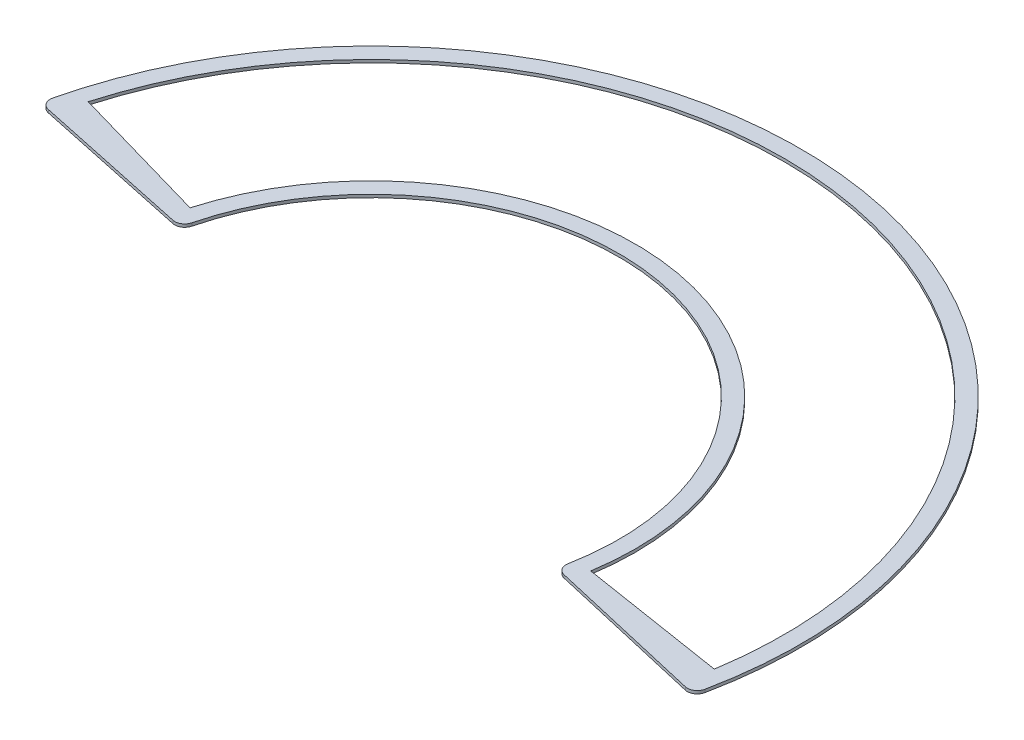
ISO-10303-21;
HEADER;
FILE_DESCRIPTION(('STEP AP214'),'2;1');
FILE_NAME('part.step','',(''),(''),'','','');
FILE_SCHEMA(('AUTOMOTIVE_DESIGN { 1 0 10303 214 1 1 1 1 }'));
ENDSEC;
DATA;
#1=APPLICATION_CONTEXT('core data for automotive mechanical design processes');
#2=APPLICATION_PROTOCOL_DEFINITION('international standard','automotive_design',2000,#1);
#3=PRODUCT_CONTEXT('',#1,'mechanical');
#4=PRODUCT('Part','Part','',(#3));
#5=PRODUCT_RELATED_PRODUCT_CATEGORY('part','',(#4));
#6=PRODUCT_DEFINITION_FORMATION('','',#4);
#7=PRODUCT_DEFINITION_CONTEXT('part definition',#1,'design');
#8=PRODUCT_DEFINITION('design','',#6,#7);
#9=PRODUCT_DEFINITION_SHAPE('','',#8);
#10=(LENGTH_UNIT() NAMED_UNIT(*) SI_UNIT(.MILLI.,.METRE.));
#11=(NAMED_UNIT(*) PLANE_ANGLE_UNIT() SI_UNIT($,.RADIAN.));
#12=(NAMED_UNIT(*) SI_UNIT($,.STERADIAN.) SOLID_ANGLE_UNIT());
#13=UNCERTAINTY_MEASURE_WITH_UNIT(LENGTH_MEASURE(1.E-05),#10,'distance_accuracy_value','');
#14=(GEOMETRIC_REPRESENTATION_CONTEXT(3) GLOBAL_UNCERTAINTY_ASSIGNED_CONTEXT((#13)) GLOBAL_UNIT_ASSIGNED_CONTEXT((#10,
#11,#12)) REPRESENTATION_CONTEXT('',''));
#15=CARTESIAN_POINT('',(0.,0.,0.));
#16=DIRECTION('',(0.,0.,1.));
#17=DIRECTION('',(1.,0.,0.));
#18=AXIS2_PLACEMENT_3D('',#15,#16,#17);
#19=CARTESIAN_POINT('',(124.38532164962,-0.9,25.6377018884395));
#20=DIRECTION('',(0.,1.,0.));
#21=DIRECTION('',(0.,0.,1.));
#22=AXIS2_PLACEMENT_3D('',#19,#20,#21);
#23=CYLINDRICAL_SURFACE('',#22,3.);
#24=CARTESIAN_POINT('',(124.38532164962,0.,25.6377018884395));
#25=DIRECTION('',(0.,1.,0.));
#26=DIRECTION('',(0.,0.,1.));
#27=AXIS2_PLACEMENT_3D('',#24,#25,#26);
#28=CIRCLE('',#27,3.);
#29=CARTESIAN_POINT('',(123.710468486589,0.,28.5608120827952));
#30=VERTEX_POINT('',#29);
#31=CARTESIAN_POINT('',(127.3235575941,0.,26.2433168936783));
#32=VERTEX_POINT('',#31);
#33=EDGE_CURVE('E160',#30,#32,#28,.T.);
#34=ORIENTED_EDGE('',*,*,#33,.F.);
#35=DIRECTION('',(0.,1.,0.));
#36=VECTOR('',#35,1.);
#37=CARTESIAN_POINT('',(123.710468486589,-0.9,28.5608120827952));
#38=LINE('',#37,#36);
#39=CARTESIAN_POINT('',(123.710468486589,-0.9,28.5608120827952));
#40=VERTEX_POINT('',#39);
#41=EDGE_CURVE('E11',#40,#30,#38,.T.);
#42=ORIENTED_EDGE('',*,*,#41,.F.);
#43=CARTESIAN_POINT('',(124.38532164962,-0.9,25.6377018884395));
#44=DIRECTION('',(0.,1.,0.));
#45=DIRECTION('',(0.,0.,1.));
#46=AXIS2_PLACEMENT_3D('',#43,#44,#45);
#47=CIRCLE('',#46,3.);
#48=CARTESIAN_POINT('',(127.3235575941,-0.9,26.2433168936783));
#49=VERTEX_POINT('',#48);
#50=EDGE_CURVE('E164',#40,#49,#47,.T.);
#51=ORIENTED_EDGE('',*,*,#50,.T.);
#52=DIRECTION('',(0.,1.,0.));
#53=VECTOR('',#52,1.);
#54=CARTESIAN_POINT('',(127.3235575941,-0.9,26.2433168936783));
#55=LINE('',#54,#53);
#56=EDGE_CURVE('E41',#49,#32,#55,.T.);
#57=ORIENTED_EDGE('',*,*,#56,.T.);
#58=EDGE_LOOP('',(#34,#42,#51,#57));
#59=FACE_BOUND('',#58,.T.);
#60=ADVANCED_FACE('F38',(#59),#23,.T.);
#61=CARTESIAN_POINT('',(75.9446305911992,-0.9,17.5331994902896));
#62=DIRECTION('',(-0.224951054343869,0.,0.974370064785234));
#63=DIRECTION('',(0.974370064785234,0.,0.224951054343869));
#64=AXIS2_PLACEMENT_3D('',#61,#62,#63);
#65=PLANE('',#64);
#66=DIRECTION('',(0.974370064785234,0.,0.224951054343869));
#67=VECTOR('',#66,1.);
#68=CARTESIAN_POINT('',(75.9446305911992,0.,17.5331994902896));
#69=LINE('',#68,#67);
#70=CARTESIAN_POINT('',(75.9446305911992,0.,17.5331994902896));
#71=VERTEX_POINT('',#70);
#72=EDGE_CURVE('E168',#71,#30,#69,.T.);
#73=ORIENTED_EDGE('',*,*,#72,.F.);
#74=DIRECTION('',(0.,1.,0.));
#75=VECTOR('',#74,1.);
#76=CARTESIAN_POINT('',(75.9446305911992,-0.9,17.5331994902896));
#77=LINE('',#76,#75);
#78=CARTESIAN_POINT('',(75.9446305911992,-0.9,17.5331994902896));
#79=VERTEX_POINT('',#78);
#80=EDGE_CURVE('E46',#79,#71,#77,.T.);
#81=ORIENTED_EDGE('',*,*,#80,.F.);
#82=DIRECTION('',(0.974370064785234,0.,0.224951054343869));
#83=VECTOR('',#82,1.);
#84=CARTESIAN_POINT('',(75.9446305911992,-0.9,17.5331994902896));
#85=LINE('',#84,#83);
#86=EDGE_CURVE('E186',#79,#40,#85,.T.);
#87=ORIENTED_EDGE('',*,*,#86,.T.);
#88=ORIENTED_EDGE('',*,*,#41,.T.);
#89=EDGE_LOOP('',(#73,#81,#87,#88));
#90=FACE_BOUND('',#89,.T.);
#91=ADVANCED_FACE('F233',(#90),#65,.T.);
#92=CARTESIAN_POINT('',(76.6194837542308,-0.9,14.6100892959339));
#93=DIRECTION('',(0.,1.,0.));
#94=DIRECTION('',(0.,0.,1.));
#95=AXIS2_PLACEMENT_3D('',#92,#93,#94);
#96=CYLINDRICAL_SURFACE('',#95,3.00000000000001);
#97=CARTESIAN_POINT('',(76.6194837542308,0.,14.6100892959339));
#98=DIRECTION('',(0.,1.,0.));
#99=DIRECTION('',(0.,0.,1.));
#100=AXIS2_PLACEMENT_3D('',#97,#98,#99);
#101=CIRCLE('',#100,3.00000000000001);
#102=CARTESIAN_POINT('',(73.6725805329142,0.,14.0481627845518));
#103=VERTEX_POINT('',#102);
#104=EDGE_CURVE('E206',#103,#71,#101,.T.);
#105=ORIENTED_EDGE('',*,*,#104,.F.);
#106=DIRECTION('',(0.,1.,0.));
#107=VECTOR('',#106,1.);
#108=CARTESIAN_POINT('',(73.6725805329142,-0.9,14.0481627845518));
#109=LINE('',#108,#107);
#110=CARTESIAN_POINT('',(73.6725805329142,-0.9,14.0481627845518));
#111=VERTEX_POINT('',#110);
#112=EDGE_CURVE('E212',#111,#103,#109,.T.);
#113=ORIENTED_EDGE('',*,*,#112,.F.);
#114=CARTESIAN_POINT('',(76.6194837542308,-0.9,14.6100892959339));
#115=DIRECTION('',(0.,1.,0.));
#116=DIRECTION('',(0.,0.,1.));
#117=AXIS2_PLACEMENT_3D('',#114,#115,#116);
#118=CIRCLE('',#117,3.00000000000001);
#119=EDGE_CURVE('E183',#111,#79,#118,.T.);
#120=ORIENTED_EDGE('',*,*,#119,.T.);
#121=ORIENTED_EDGE('',*,*,#80,.T.);
#122=EDGE_LOOP('',(#105,#113,#120,#121));
#123=FACE_BOUND('',#122,.T.);
#124=ADVANCED_FACE('F252',(#123),#96,.T.);
#125=CARTESIAN_POINT('',(0.,-0.9,0.));
#126=DIRECTION('',(0.,1.,0.));
#127=DIRECTION('',(0.,0.,1.));
#128=AXIS2_PLACEMENT_3D('',#125,#126,#127);
#129=CYLINDRICAL_SURFACE('',#128,75.);
#130=CARTESIAN_POINT('',(0.,0.,0.));
#131=DIRECTION('',(0.,-1.,0.));
#132=DIRECTION('',(0.,0.,1.));
#133=AXIS2_PLACEMENT_3D('',#130,#131,#132);
#134=CIRCLE('',#133,75.);
#135=CARTESIAN_POINT('',(-72.7070435647225,0.,-18.4034185975742));
#136=VERTEX_POINT('',#135);
#137=EDGE_CURVE('E203',#136,#103,#134,.T.);
#138=ORIENTED_EDGE('',*,*,#137,.F.);
#139=DIRECTION('',(0.,1.,0.));
#140=VECTOR('',#139,1.);
#141=CARTESIAN_POINT('',(-72.7070435647225,-0.9,-18.4034185975742));
#142=LINE('',#141,#140);
#143=CARTESIAN_POINT('',(-72.7070435647225,-0.9,-18.4034185975742));
#144=VERTEX_POINT('',#143);
#145=EDGE_CURVE('E214',#144,#136,#142,.T.);
#146=ORIENTED_EDGE('',*,*,#145,.F.);
#147=CARTESIAN_POINT('',(0.,-0.9,0.));
#148=DIRECTION('',(0.,-1.,0.));
#149=DIRECTION('',(0.,0.,1.));
#150=AXIS2_PLACEMENT_3D('',#147,#148,#149);
#151=CIRCLE('',#150,75.);
#152=EDGE_CURVE('E180',#144,#111,#151,.T.);
#153=ORIENTED_EDGE('',*,*,#152,.T.);
#154=ORIENTED_EDGE('',*,*,#112,.T.);
#155=EDGE_LOOP('',(#138,#146,#153,#154));
#156=FACE_BOUND('',#155,.T.);
#157=ADVANCED_FACE('F250',(#156),#129,.F.);
#158=CARTESIAN_POINT('',(-75.6153253073114,-0.9,-19.1395553414771));
#159=DIRECTION('',(0.,1.,0.));
#160=DIRECTION('',(0.,0.,1.));
#161=AXIS2_PLACEMENT_3D('',#158,#159,#160);
#162=CYLINDRICAL_SURFACE('',#161,2.99999999999999);
#163=CARTESIAN_POINT('',(-75.6153253073114,0.,-19.1395553414771));
#164=DIRECTION('',(0.,1.,0.));
#165=DIRECTION('',(0.,0.,-1.));
#166=AXIS2_PLACEMENT_3D('',#163,#164,#165);
#167=CIRCLE('',#166,2.99999999999999);
#168=CARTESIAN_POINT('',(-76.2390603797647,0.,-16.2051125392757));
#169=VERTEX_POINT('',#168);
#170=EDGE_CURVE('E200',#169,#136,#167,.T.);
#171=ORIENTED_EDGE('',*,*,#170,.F.);
#172=DIRECTION('',(0.,1.,0.));
#173=VECTOR('',#172,1.);
#174=CARTESIAN_POINT('',(-76.2390603797647,-0.9,-16.2051125392757));
#175=LINE('',#174,#173);
#176=CARTESIAN_POINT('',(-76.2390603797647,-0.9,-16.2051125392757));
#177=VERTEX_POINT('',#176);
#178=EDGE_CURVE('E216',#177,#169,#175,.T.);
#179=ORIENTED_EDGE('',*,*,#178,.F.);
#180=CARTESIAN_POINT('',(-75.6153253073114,-0.9,-19.1395553414771));
#181=DIRECTION('',(0.,1.,0.));
#182=DIRECTION('',(0.,0.,-1.));
#183=AXIS2_PLACEMENT_3D('',#180,#181,#182);
#184=CIRCLE('',#183,2.99999999999999);
#185=EDGE_CURVE('E177',#177,#144,#184,.T.);
#186=ORIENTED_EDGE('',*,*,#185,.T.);
#187=ORIENTED_EDGE('',*,*,#145,.T.);
#188=EDGE_LOOP('',(#171,#179,#186,#187));
#189=FACE_BOUND('',#188,.T.);
#190=ADVANCED_FACE('F246',(#189),#162,.T.);
#191=CARTESIAN_POINT('',(-76.2390603797647,-0.9,-16.2051125392757));
#192=DIRECTION('',(-0.207911690817756,0.,0.978147600733806));
#193=DIRECTION('',(0.978147600733806,0.,0.207911690817756));
#194=AXIS2_PLACEMENT_3D('',#191,#192,#193);
#195=PLANE('',#194);
#196=DIRECTION('',(0.978147600733806,0.,0.207911690817756));
#197=VECTOR('',#196,1.);
#198=CARTESIAN_POINT('',(-76.2390603797647,0.,-16.2051125392757));
#199=LINE('',#198,#197);
#200=CARTESIAN_POINT('',(-124.190081683681,0.,-26.397416756202));
#201=VERTEX_POINT('',#200);
#202=EDGE_CURVE('E197',#201,#169,#199,.T.);
#203=ORIENTED_EDGE('',*,*,#202,.F.);
#204=DIRECTION('',(0.,1.,0.));
#205=VECTOR('',#204,1.);
#206=CARTESIAN_POINT('',(-124.190081683681,-0.9,-26.397416756202));
#207=LINE('',#206,#205);
#208=CARTESIAN_POINT('',(-124.190081683681,-0.9,-26.397416756202));
#209=VERTEX_POINT('',#208);
#210=EDGE_CURVE('E218',#209,#201,#207,.T.);
#211=ORIENTED_EDGE('',*,*,#210,.F.);
#212=DIRECTION('',(0.978147600733806,0.,0.207911690817756));
#213=VECTOR('',#212,1.);
#214=CARTESIAN_POINT('',(-76.2390603797647,-0.9,-16.2051125392757));
#215=LINE('',#214,#213);
#216=EDGE_CURVE('E174',#209,#177,#215,.T.);
#217=ORIENTED_EDGE('',*,*,#216,.T.);
#218=ORIENTED_EDGE('',*,*,#178,.T.);
#219=EDGE_LOOP('',(#203,#211,#217,#218));
#220=FACE_BOUND('',#219,.T.);
#221=ADVANCED_FACE('F244',(#220),#195,.T.);
#222=CARTESIAN_POINT('',(-123.566346611228,-0.9,-29.3318595584034));
#223=DIRECTION('',(0.,1.,0.));
#224=DIRECTION('',(0.,0.,1.));
#225=AXIS2_PLACEMENT_3D('',#222,#223,#224);
#226=CYLINDRICAL_SURFACE('',#225,3.);
#227=CARTESIAN_POINT('',(-123.566346611228,0.,-29.3318595584034));
#228=DIRECTION('',(0.,1.,0.));
#229=DIRECTION('',(0.,0.,-1.));
#230=AXIS2_PLACEMENT_3D('',#227,#228,#229);
#231=CIRCLE('',#230,3.);
#232=CARTESIAN_POINT('',(-126.485236688658,0.,-30.0247381306492));
#233=VERTEX_POINT('',#232);
#234=EDGE_CURVE('E194',#233,#201,#231,.T.);
#235=ORIENTED_EDGE('',*,*,#234,.F.);
#236=DIRECTION('',(0.,1.,0.));
#237=VECTOR('',#236,1.);
#238=CARTESIAN_POINT('',(-126.485236688658,-0.9,-30.0247381306492));
#239=LINE('',#238,#237);
#240=CARTESIAN_POINT('',(-126.485236688658,-0.9,-30.0247381306492));
#241=VERTEX_POINT('',#240);
#242=EDGE_CURVE('E219',#241,#233,#239,.T.);
#243=ORIENTED_EDGE('',*,*,#242,.F.);
#244=CARTESIAN_POINT('',(-123.566346611228,-0.9,-29.3318595584034));
#245=DIRECTION('',(0.,1.,0.));
#246=DIRECTION('',(0.,0.,-1.));
#247=AXIS2_PLACEMENT_3D('',#244,#245,#246);
#248=CIRCLE('',#247,3.);
#249=EDGE_CURVE('E171',#241,#209,#248,.T.);
#250=ORIENTED_EDGE('',*,*,#249,.T.);
#251=ORIENTED_EDGE('',*,*,#210,.T.);
#252=EDGE_LOOP('',(#235,#243,#250,#251));
#253=FACE_BOUND('',#252,.T.);
#254=ADVANCED_FACE('F240',(#253),#226,.T.);
#255=CARTESIAN_POINT('',(0.,-0.9,0.));
#256=DIRECTION('',(0.,1.,0.));
#257=DIRECTION('',(0.,0.,1.));
#258=AXIS2_PLACEMENT_3D('',#255,#256,#257);
#259=CYLINDRICAL_SURFACE('',#258,130.);
#260=CARTESIAN_POINT('',(0.,0.,0.));
#261=DIRECTION('',(0.,1.,0.));
#262=DIRECTION('',(0.,0.,1.));
#263=AXIS2_PLACEMENT_3D('',#260,#261,#262);
#264=CIRCLE('',#263,130.);
#265=EDGE_CURVE('E191',#32,#233,#264,.T.);
#266=ORIENTED_EDGE('',*,*,#265,.F.);
#267=ORIENTED_EDGE('',*,*,#56,.F.);
#268=CARTESIAN_POINT('',(0.,-0.9,0.));
#269=DIRECTION('',(0.,1.,0.));
#270=DIRECTION('',(0.,0.,1.));
#271=AXIS2_PLACEMENT_3D('',#268,#269,#270);
#272=CIRCLE('',#271,130.);
#273=EDGE_CURVE('E167',#49,#241,#272,.T.);
#274=ORIENTED_EDGE('',*,*,#273,.T.);
#275=ORIENTED_EDGE('',*,*,#242,.T.);
#276=EDGE_LOOP('',(#266,#267,#274,#275));
#277=FACE_BOUND('',#276,.T.);
#278=ADVANCED_FACE('F227',(#277),#259,.T.);
#279=CARTESIAN_POINT('',(124.38532164962,-0.9,25.6377018884395));
#280=DIRECTION('',(0.,1.,0.));
#281=DIRECTION('',(0.,0.,1.));
#282=AXIS2_PLACEMENT_3D('',#279,#280,#281);
#283=PLANE('',#282);
#284=DIRECTION('',(0.987688340595137,0.,0.156434465040234));
#285=VECTOR('',#284,1.);
#286=CARTESIAN_POINT('',(79.015067247611,-0.9,12.5147572032188));
#287=LINE('',#286,#285);
#288=CARTESIAN_POINT('',(79.015067247611,-0.9,12.5147572032188));
#289=VERTEX_POINT('',#288);
#290=CARTESIAN_POINT('',(123.461042574392,-0.9,19.5543081300293));
#291=VERTEX_POINT('',#290);
#292=EDGE_CURVE('E135',#289,#291,#287,.T.);
#293=ORIENTED_EDGE('',*,*,#292,.T.);
#294=CARTESIAN_POINT('',(0.,-0.9,0.));
#295=DIRECTION('',(0.,1.,0.));
#296=DIRECTION('',(0.,0.,1.));
#297=AXIS2_PLACEMENT_3D('',#294,#295,#296);
#298=CIRCLE('',#297,125.);
#299=CARTESIAN_POINT('',(-120.15771199229,-0.9,-34.4546694771245));
#300=VERTEX_POINT('',#299);
#301=EDGE_CURVE('E129',#291,#300,#298,.T.);
#302=ORIENTED_EDGE('',*,*,#301,.T.);
#303=DIRECTION('',(0.96126169593832,0.,0.275637355816996));
#304=VECTOR('',#303,1.);
#305=CARTESIAN_POINT('',(-76.9009356750656,-0.9,-22.0509884653597));
#306=LINE('',#305,#304);
#307=CARTESIAN_POINT('',(-76.9009356750656,-0.9,-22.0509884653597));
#308=VERTEX_POINT('',#307);
#309=EDGE_CURVE('E138',#300,#308,#306,.T.);
#310=ORIENTED_EDGE('',*,*,#309,.T.);
#311=CARTESIAN_POINT('',(0.,-0.9,0.));
#312=DIRECTION('',(0.,-1.,0.));
#313=DIRECTION('',(0.,0.,1.));
#314=AXIS2_PLACEMENT_3D('',#311,#312,#313);
#315=CIRCLE('',#314,80.);
#316=EDGE_CURVE('E54',#308,#289,#315,.T.);
#317=ORIENTED_EDGE('',*,*,#316,.T.);
#318=EDGE_LOOP('',(#293,#302,#310,#317));
#319=FACE_BOUND('',#318,.T.);
#320=ORIENTED_EDGE('',*,*,#50,.F.);
#321=ORIENTED_EDGE('',*,*,#86,.F.);
#322=ORIENTED_EDGE('',*,*,#119,.F.);
#323=ORIENTED_EDGE('',*,*,#152,.F.);
#324=ORIENTED_EDGE('',*,*,#185,.F.);
#325=ORIENTED_EDGE('',*,*,#216,.F.);
#326=ORIENTED_EDGE('',*,*,#249,.F.);
#327=ORIENTED_EDGE('',*,*,#273,.F.);
#328=EDGE_LOOP('',(#320,#321,#322,#323,#324,#325,#326,#327));
#329=FACE_BOUND('',#328,.T.);
#330=ADVANCED_FACE('F142',(#319,#329),#283,.F.);
#331=CARTESIAN_POINT('',(124.38532164962,0.,25.6377018884395));
#332=DIRECTION('',(0.,1.,0.));
#333=DIRECTION('',(0.,0.,1.));
#334=AXIS2_PLACEMENT_3D('',#331,#332,#333);
#335=PLANE('',#334);
#336=CARTESIAN_POINT('',(0.,0.,0.));
#337=DIRECTION('',(0.,1.,0.));
#338=DIRECTION('',(0.,0.,1.));
#339=AXIS2_PLACEMENT_3D('',#336,#337,#338);
#340=CIRCLE('',#339,125.);
#341=CARTESIAN_POINT('',(123.461042574392,0.,19.5543081300293));
#342=VERTEX_POINT('',#341);
#343=CARTESIAN_POINT('',(-120.15771199229,0.,-34.4546694771245));
#344=VERTEX_POINT('',#343);
#345=EDGE_CURVE('E62',#342,#344,#340,.T.);
#346=ORIENTED_EDGE('',*,*,#345,.F.);
#347=DIRECTION('',(0.987688340595137,0.,0.156434465040234));
#348=VECTOR('',#347,1.);
#349=CARTESIAN_POINT('',(79.015067247611,0.,12.5147572032188));
#350=LINE('',#349,#348);
#351=CARTESIAN_POINT('',(79.015067247611,0.,12.5147572032188));
#352=VERTEX_POINT('',#351);
#353=EDGE_CURVE('E145',#352,#342,#350,.T.);
#354=ORIENTED_EDGE('',*,*,#353,.F.);
#355=CARTESIAN_POINT('',(0.,0.,0.));
#356=DIRECTION('',(0.,-1.,0.));
#357=DIRECTION('',(0.,0.,1.));
#358=AXIS2_PLACEMENT_3D('',#355,#356,#357);
#359=CIRCLE('',#358,80.);
#360=CARTESIAN_POINT('',(-76.9009356750656,0.,-22.0509884653597));
#361=VERTEX_POINT('',#360);
#362=EDGE_CURVE('E148',#361,#352,#359,.T.);
#363=ORIENTED_EDGE('',*,*,#362,.F.);
#364=DIRECTION('',(0.96126169593832,0.,0.275637355816996));
#365=VECTOR('',#364,1.);
#366=CARTESIAN_POINT('',(-76.9009356750656,0.,-22.0509884653597));
#367=LINE('',#366,#365);
#368=EDGE_CURVE('E154',#344,#361,#367,.T.);
#369=ORIENTED_EDGE('',*,*,#368,.F.);
#370=EDGE_LOOP('',(#346,#354,#363,#369));
#371=FACE_BOUND('',#370,.T.);
#372=ORIENTED_EDGE('',*,*,#33,.T.);
#373=ORIENTED_EDGE('',*,*,#265,.T.);
#374=ORIENTED_EDGE('',*,*,#234,.T.);
#375=ORIENTED_EDGE('',*,*,#202,.T.);
#376=ORIENTED_EDGE('',*,*,#170,.T.);
#377=ORIENTED_EDGE('',*,*,#137,.T.);
#378=ORIENTED_EDGE('',*,*,#104,.T.);
#379=ORIENTED_EDGE('',*,*,#72,.T.);
#380=EDGE_LOOP('',(#372,#373,#374,#375,#376,#377,#378,#379));
#381=FACE_BOUND('',#380,.T.);
#382=ADVANCED_FACE('F229',(#371,#381),#335,.T.);
#383=CARTESIAN_POINT('',(0.,-0.9,0.));
#384=DIRECTION('',(0.,1.,0.));
#385=DIRECTION('',(0.,0.,1.));
#386=AXIS2_PLACEMENT_3D('',#383,#384,#385);
#387=CYLINDRICAL_SURFACE('',#386,125.);
#388=ORIENTED_EDGE('',*,*,#345,.T.);
#389=DIRECTION('',(0.,1.,0.));
#390=VECTOR('',#389,1.);
#391=CARTESIAN_POINT('',(-120.15771199229,-0.9,-34.4546694771245));
#392=LINE('',#391,#390);
#393=EDGE_CURVE('E125',#300,#344,#392,.T.);
#394=ORIENTED_EDGE('',*,*,#393,.F.);
#395=ORIENTED_EDGE('',*,*,#301,.F.);
#396=DIRECTION('',(0.,1.,0.));
#397=VECTOR('',#396,1.);
#398=CARTESIAN_POINT('',(123.461042574392,-0.9,19.5543081300293));
#399=LINE('',#398,#397);
#400=EDGE_CURVE('E158',#291,#342,#399,.T.);
#401=ORIENTED_EDGE('',*,*,#400,.T.);
#402=EDGE_LOOP('',(#388,#394,#395,#401));
#403=FACE_BOUND('',#402,.T.);
#404=ADVANCED_FACE('F127',(#403),#387,.F.);
#405=CARTESIAN_POINT('',(79.015067247611,-0.9,12.5147572032188));
#406=DIRECTION('',(-0.156434465040234,0.,0.987688340595137));
#407=DIRECTION('',(0.987688340595137,0.,0.156434465040234));
#408=AXIS2_PLACEMENT_3D('',#405,#406,#407);
#409=PLANE('',#408);
#410=ORIENTED_EDGE('',*,*,#353,.T.);
#411=ORIENTED_EDGE('',*,*,#400,.F.);
#412=ORIENTED_EDGE('',*,*,#292,.F.);
#413=DIRECTION('',(0.,1.,0.));
#414=VECTOR('',#413,1.);
#415=CARTESIAN_POINT('',(79.015067247611,-0.9,12.5147572032188));
#416=LINE('',#415,#414);
#417=EDGE_CURVE('E161',#289,#352,#416,.T.);
#418=ORIENTED_EDGE('',*,*,#417,.T.);
#419=EDGE_LOOP('',(#410,#411,#412,#418));
#420=FACE_BOUND('',#419,.T.);
#421=ADVANCED_FACE('F344',(#420),#409,.F.);
#422=CARTESIAN_POINT('',(0.,-0.9,0.));
#423=DIRECTION('',(0.,1.,0.));
#424=DIRECTION('',(0.,0.,1.));
#425=AXIS2_PLACEMENT_3D('',#422,#423,#424);
#426=CYLINDRICAL_SURFACE('',#425,80.);
#427=ORIENTED_EDGE('',*,*,#362,.T.);
#428=ORIENTED_EDGE('',*,*,#417,.F.);
#429=ORIENTED_EDGE('',*,*,#316,.F.);
#430=DIRECTION('',(0.,1.,0.));
#431=VECTOR('',#430,1.);
#432=CARTESIAN_POINT('',(-76.9009356750656,-0.9,-22.0509884653597));
#433=LINE('',#432,#431);
#434=EDGE_CURVE('E134',#308,#361,#433,.T.);
#435=ORIENTED_EDGE('',*,*,#434,.T.);
#436=EDGE_LOOP('',(#427,#428,#429,#435));
#437=FACE_BOUND('',#436,.T.);
#438=ADVANCED_FACE('F354',(#437),#426,.T.);
#439=CARTESIAN_POINT('',(-76.9009356750656,-0.9,-22.0509884653597));
#440=DIRECTION('',(-0.275637355816996,0.,0.96126169593832));
#441=DIRECTION('',(0.96126169593832,0.,0.275637355816996));
#442=AXIS2_PLACEMENT_3D('',#439,#440,#441);
#443=PLANE('',#442);
#444=ORIENTED_EDGE('',*,*,#368,.T.);
#445=ORIENTED_EDGE('',*,*,#434,.F.);
#446=ORIENTED_EDGE('',*,*,#309,.F.);
#447=ORIENTED_EDGE('',*,*,#393,.T.);
#448=EDGE_LOOP('',(#444,#445,#446,#447));
#449=FACE_BOUND('',#448,.T.);
#450=ADVANCED_FACE('F139',(#449),#443,.F.);
#451=CLOSED_SHELL('',(#60,#91,#124,#157,#190,#221,#254,#278,#330,#382,#404,#421,#438,#450));
#452=MANIFOLD_SOLID_BREP('B2',#451);
#453=ADVANCED_BREP_SHAPE_REPRESENTATION('',(#18,#452),#14);
#454=SHAPE_DEFINITION_REPRESENTATION(#9,#453);
ENDSEC;
END-ISO-10303-21;
